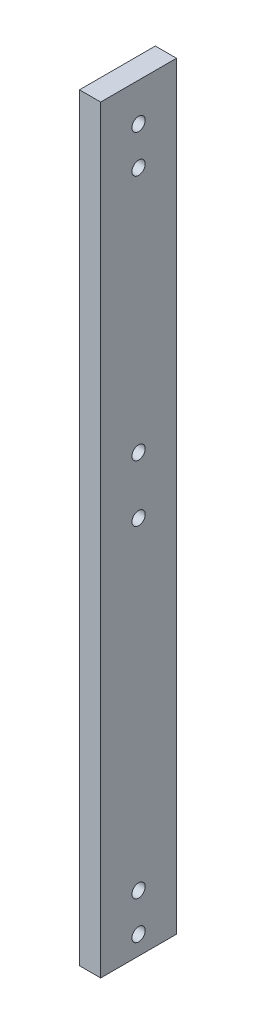
ISO-10303-21;
HEADER;
FILE_DESCRIPTION(('STEP AP214'),'2;1');
FILE_NAME('part.step','',(''),(''),'','','');
FILE_SCHEMA(('AUTOMOTIVE_DESIGN { 1 0 10303 214 1 1 1 1 }'));
ENDSEC;
DATA;
#1=APPLICATION_CONTEXT('core data for automotive mechanical design processes');
#2=APPLICATION_PROTOCOL_DEFINITION('international standard','automotive_design',2000,#1);
#3=PRODUCT_CONTEXT('',#1,'mechanical');
#4=PRODUCT('Part','Part','',(#3));
#5=PRODUCT_RELATED_PRODUCT_CATEGORY('part','',(#4));
#6=PRODUCT_DEFINITION_FORMATION('','',#4);
#7=PRODUCT_DEFINITION_CONTEXT('part definition',#1,'design');
#8=PRODUCT_DEFINITION('design','',#6,#7);
#9=PRODUCT_DEFINITION_SHAPE('','',#8);
#10=(LENGTH_UNIT() NAMED_UNIT(*) SI_UNIT(.MILLI.,.METRE.));
#11=(NAMED_UNIT(*) PLANE_ANGLE_UNIT() SI_UNIT($,.RADIAN.));
#12=(NAMED_UNIT(*) SI_UNIT($,.STERADIAN.) SOLID_ANGLE_UNIT());
#13=UNCERTAINTY_MEASURE_WITH_UNIT(LENGTH_MEASURE(1.E-05),#10,'distance_accuracy_value','');
#14=(GEOMETRIC_REPRESENTATION_CONTEXT(3) GLOBAL_UNCERTAINTY_ASSIGNED_CONTEXT((#13)) GLOBAL_UNIT_ASSIGNED_CONTEXT((#10,
#11,#12)) REPRESENTATION_CONTEXT('',''));
#15=CARTESIAN_POINT('',(0.,0.,0.));
#16=DIRECTION('',(0.,0.,1.));
#17=DIRECTION('',(1.,0.,0.));
#18=AXIS2_PLACEMENT_3D('',#15,#16,#17);
#19=CARTESIAN_POINT('',(5.588,-63.9338497155783,6.74242007213014));
#20=DIRECTION('',(0.,0.,-1.));
#21=DIRECTION('',(-1.,0.,0.));
#22=AXIS2_PLACEMENT_3D('',#19,#20,#21);
#23=PLANE('',#22);
#24=DIRECTION('',(0.,-1.,0.));
#25=VECTOR('',#24,1.);
#26=CARTESIAN_POINT('',(0.,-63.9338497155783,6.74242007213014));
#27=LINE('',#26,#25);
#28=CARTESIAN_POINT('',(0.,136.066150284422,6.74242007213014));
#29=VERTEX_POINT('',#28);
#30=CARTESIAN_POINT('',(0.,-63.9338497155783,6.74242007213014));
#31=VERTEX_POINT('',#30);
#32=EDGE_CURVE('E96',#29,#31,#27,.T.);
#33=ORIENTED_EDGE('',*,*,#32,.T.);
#34=DIRECTION('',(-1.,0.,0.));
#35=VECTOR('',#34,1.);
#36=CARTESIAN_POINT('',(5.588,-63.9338497155783,6.74242007213014));
#37=LINE('',#36,#35);
#38=CARTESIAN_POINT('',(5.588,-63.9338497155783,6.74242007213014));
#39=VERTEX_POINT('',#38);
#40=EDGE_CURVE('E11',#39,#31,#37,.T.);
#41=ORIENTED_EDGE('',*,*,#40,.F.);
#42=DIRECTION('',(0.,-1.,0.));
#43=VECTOR('',#42,1.);
#44=CARTESIAN_POINT('',(5.588,-63.9338497155783,6.74242007213014));
#45=LINE('',#44,#43);
#46=CARTESIAN_POINT('',(5.588,136.066150284422,6.74242007213014));
#47=VERTEX_POINT('',#46);
#48=EDGE_CURVE('E84',#47,#39,#45,.T.);
#49=ORIENTED_EDGE('',*,*,#48,.F.);
#50=DIRECTION('',(-1.,0.,0.));
#51=VECTOR('',#50,1.);
#52=CARTESIAN_POINT('',(5.588,136.066150284422,6.74242007213014));
#53=LINE('',#52,#51);
#54=EDGE_CURVE('E92',#47,#29,#53,.T.);
#55=ORIENTED_EDGE('',*,*,#54,.T.);
#56=EDGE_LOOP('',(#33,#41,#49,#55));
#57=FACE_BOUND('',#56,.T.);
#58=ADVANCED_FACE('F33',(#57),#23,.F.);
#59=CARTESIAN_POINT('',(5.588,-63.9338497155783,6.74242007213014));
#60=DIRECTION('',(0.,1.,0.));
#61=DIRECTION('',(0.,0.,1.));
#62=AXIS2_PLACEMENT_3D('',#59,#60,#61);
#63=PLANE('',#62);
#64=DIRECTION('',(0.,0.,-1.));
#65=VECTOR('',#64,1.);
#66=CARTESIAN_POINT('',(0.,-63.9338497155783,6.74242007213014));
#67=LINE('',#66,#65);
#68=CARTESIAN_POINT('',(0.,-63.9338497155783,-13.2575799278699));
#69=VERTEX_POINT('',#68);
#70=EDGE_CURVE('E88',#31,#69,#67,.T.);
#71=ORIENTED_EDGE('',*,*,#70,.T.);
#72=DIRECTION('',(-1.,0.,0.));
#73=VECTOR('',#72,1.);
#74=CARTESIAN_POINT('',(5.588,-63.9338497155783,-13.2575799278699));
#75=LINE('',#74,#73);
#76=CARTESIAN_POINT('',(5.588,-63.9338497155783,-13.2575799278699));
#77=VERTEX_POINT('',#76);
#78=EDGE_CURVE('E41',#77,#69,#75,.T.);
#79=ORIENTED_EDGE('',*,*,#78,.F.);
#80=DIRECTION('',(0.,0.,-1.));
#81=VECTOR('',#80,1.);
#82=CARTESIAN_POINT('',(5.588,-63.9338497155783,6.74242007213014));
#83=LINE('',#82,#81);
#84=EDGE_CURVE('E79',#39,#77,#83,.T.);
#85=ORIENTED_EDGE('',*,*,#84,.F.);
#86=ORIENTED_EDGE('',*,*,#40,.T.);
#87=EDGE_LOOP('',(#71,#79,#85,#86));
#88=FACE_BOUND('',#87,.T.);
#89=ADVANCED_FACE('F87',(#88),#63,.F.);
#90=CARTESIAN_POINT('',(5.588,-63.9338497155783,-13.2575799278699));
#91=DIRECTION('',(0.,0.,1.));
#92=DIRECTION('',(0.,-1.,0.));
#93=AXIS2_PLACEMENT_3D('',#90,#91,#92);
#94=PLANE('',#93);
#95=DIRECTION('',(0.,1.,0.));
#96=VECTOR('',#95,1.);
#97=CARTESIAN_POINT('',(0.,-63.9338497155783,-13.2575799278699));
#98=LINE('',#97,#96);
#99=CARTESIAN_POINT('',(0.,136.066150284422,-13.2575799278699));
#100=VERTEX_POINT('',#99);
#101=EDGE_CURVE('E66',#69,#100,#98,.T.);
#102=ORIENTED_EDGE('',*,*,#101,.T.);
#103=DIRECTION('',(-1.,0.,0.));
#104=VECTOR('',#103,1.);
#105=CARTESIAN_POINT('',(5.588,136.066150284422,-13.2575799278699));
#106=LINE('',#105,#104);
#107=CARTESIAN_POINT('',(5.588,136.066150284422,-13.2575799278699));
#108=VERTEX_POINT('',#107);
#109=EDGE_CURVE('E89',#108,#100,#106,.T.);
#110=ORIENTED_EDGE('',*,*,#109,.F.);
#111=DIRECTION('',(0.,1.,0.));
#112=VECTOR('',#111,1.);
#113=CARTESIAN_POINT('',(5.588,-63.9338497155783,-13.2575799278699));
#114=LINE('',#113,#112);
#115=EDGE_CURVE('E82',#77,#108,#114,.T.);
#116=ORIENTED_EDGE('',*,*,#115,.F.);
#117=ORIENTED_EDGE('',*,*,#78,.T.);
#118=EDGE_LOOP('',(#102,#110,#116,#117));
#119=FACE_BOUND('',#118,.T.);
#120=ADVANCED_FACE('F90',(#119),#94,.F.);
#121=CARTESIAN_POINT('',(5.588,136.066150284422,6.74242007213014));
#122=DIRECTION('',(0.,-1.,0.));
#123=DIRECTION('',(0.,0.,-1.));
#124=AXIS2_PLACEMENT_3D('',#121,#122,#123);
#125=PLANE('',#124);
#126=DIRECTION('',(0.,0.,1.));
#127=VECTOR('',#126,1.);
#128=CARTESIAN_POINT('',(0.,136.066150284422,6.74242007213014));
#129=LINE('',#128,#127);
#130=EDGE_CURVE('E72',#100,#29,#129,.T.);
#131=ORIENTED_EDGE('',*,*,#130,.T.);
#132=ORIENTED_EDGE('',*,*,#54,.F.);
#133=DIRECTION('',(0.,0.,1.));
#134=VECTOR('',#133,1.);
#135=CARTESIAN_POINT('',(5.588,136.066150284422,6.74242007213014));
#136=LINE('',#135,#134);
#137=EDGE_CURVE('E49',#108,#47,#136,.T.);
#138=ORIENTED_EDGE('',*,*,#137,.F.);
#139=ORIENTED_EDGE('',*,*,#109,.T.);
#140=EDGE_LOOP('',(#131,#132,#138,#139));
#141=FACE_BOUND('',#140,.T.);
#142=ADVANCED_FACE('F104',(#141),#125,.F.);
#143=CARTESIAN_POINT('',(5.588,0.,0.));
#144=DIRECTION('',(-1.,0.,0.));
#145=DIRECTION('',(0.,0.,1.));
#146=AXIS2_PLACEMENT_3D('',#143,#144,#145);
#147=PLANE('',#146);
#148=CARTESIAN_POINT('',(5.588,51.0661502844217,-3.25757992786986));
#149=DIRECTION('',(1.,0.,0.));
#150=DIRECTION('',(0.,0.,-1.));
#151=AXIS2_PLACEMENT_3D('',#148,#149,#150);
#152=CIRCLE('',#151,1.75);
#153=CARTESIAN_POINT('',(5.588,51.0661502844217,-5.00757992786986));
#154=VERTEX_POINT('',#153);
#155=EDGE_CURVE('E140',#154,#154,#152,.T.);
#156=ORIENTED_EDGE('',*,*,#155,.F.);
#157=EDGE_LOOP('',(#156));
#158=FACE_BOUND('',#157,.T.);
#159=CARTESIAN_POINT('',(5.588,36.0661502844217,-3.25757992786986));
#160=DIRECTION('',(1.,0.,0.));
#161=DIRECTION('',(0.,0.,-1.));
#162=AXIS2_PLACEMENT_3D('',#159,#160,#161);
#163=CIRCLE('',#162,1.75);
#164=CARTESIAN_POINT('',(5.588,36.0661502844217,-5.00757992786986));
#165=VERTEX_POINT('',#164);
#166=EDGE_CURVE('E134',#165,#165,#163,.T.);
#167=ORIENTED_EDGE('',*,*,#166,.F.);
#168=EDGE_LOOP('',(#167));
#169=FACE_BOUND('',#168,.T.);
#170=CARTESIAN_POINT('',(5.588,126.066150284422,-3.25757992786986));
#171=DIRECTION('',(1.,0.,0.));
#172=DIRECTION('',(0.,0.,-1.));
#173=AXIS2_PLACEMENT_3D('',#170,#171,#172);
#174=CIRCLE('',#173,1.75);
#175=CARTESIAN_POINT('',(5.588,126.066150284422,-5.00757992786986));
#176=VERTEX_POINT('',#175);
#177=EDGE_CURVE('E128',#176,#176,#174,.T.);
#178=ORIENTED_EDGE('',*,*,#177,.F.);
#179=EDGE_LOOP('',(#178));
#180=FACE_BOUND('',#179,.T.);
#181=CARTESIAN_POINT('',(5.588,116.066150284422,-3.25757992786986));
#182=DIRECTION('',(1.,0.,0.));
#183=DIRECTION('',(0.,0.,-1.));
#184=AXIS2_PLACEMENT_3D('',#181,#182,#183);
#185=CIRCLE('',#184,1.75);
#186=CARTESIAN_POINT('',(5.588,116.066150284422,-5.00757992786986));
#187=VERTEX_POINT('',#186);
#188=EDGE_CURVE('E122',#187,#187,#185,.T.);
#189=ORIENTED_EDGE('',*,*,#188,.F.);
#190=EDGE_LOOP('',(#189));
#191=FACE_BOUND('',#190,.T.);
#192=CARTESIAN_POINT('',(5.588,-48.9338497155783,-3.25757992786986));
#193=DIRECTION('',(1.,0.,0.));
#194=DIRECTION('',(0.,0.,-1.));
#195=AXIS2_PLACEMENT_3D('',#192,#193,#194);
#196=CIRCLE('',#195,1.75);
#197=CARTESIAN_POINT('',(5.588,-48.9338497155783,-5.00757992786986));
#198=VERTEX_POINT('',#197);
#199=EDGE_CURVE('E116',#198,#198,#196,.T.);
#200=ORIENTED_EDGE('',*,*,#199,.F.);
#201=EDGE_LOOP('',(#200));
#202=FACE_BOUND('',#201,.T.);
#203=CARTESIAN_POINT('',(5.588,-58.9338497155783,-3.25757992786986));
#204=DIRECTION('',(1.,0.,0.));
#205=DIRECTION('',(0.,0.,-1.));
#206=AXIS2_PLACEMENT_3D('',#203,#204,#205);
#207=CIRCLE('',#206,1.75);
#208=CARTESIAN_POINT('',(5.588,-58.9338497155783,-5.00757992786986));
#209=VERTEX_POINT('',#208);
#210=EDGE_CURVE('E110',#209,#209,#207,.T.);
#211=ORIENTED_EDGE('',*,*,#210,.F.);
#212=EDGE_LOOP('',(#211));
#213=FACE_BOUND('',#212,.T.);
#214=ORIENTED_EDGE('',*,*,#48,.T.);
#215=ORIENTED_EDGE('',*,*,#84,.T.);
#216=ORIENTED_EDGE('',*,*,#115,.T.);
#217=ORIENTED_EDGE('',*,*,#137,.T.);
#218=EDGE_LOOP('',(#214,#215,#216,#217));
#219=FACE_BOUND('',#218,.T.);
#220=ADVANCED_FACE('F80',(#158,#169,#180,#191,#202,#213,#219),#147,.F.);
#221=CARTESIAN_POINT('',(0.,0.,0.));
#222=DIRECTION('',(-1.,0.,0.));
#223=DIRECTION('',(0.,0.,1.));
#224=AXIS2_PLACEMENT_3D('',#221,#222,#223);
#225=PLANE('',#224);
#226=CARTESIAN_POINT('',(0.,51.0661502844217,-3.25757992786986));
#227=DIRECTION('',(1.,0.,0.));
#228=DIRECTION('',(0.,0.,-1.));
#229=AXIS2_PLACEMENT_3D('',#226,#227,#228);
#230=CIRCLE('',#229,1.75);
#231=CARTESIAN_POINT('',(0.,51.0661502844217,-5.00757992786986));
#232=VERTEX_POINT('',#231);
#233=EDGE_CURVE('E137',#232,#232,#230,.T.);
#234=ORIENTED_EDGE('',*,*,#233,.T.);
#235=EDGE_LOOP('',(#234));
#236=FACE_BOUND('',#235,.T.);
#237=CARTESIAN_POINT('',(0.,36.0661502844217,-3.25757992786986));
#238=DIRECTION('',(1.,0.,0.));
#239=DIRECTION('',(0.,0.,-1.));
#240=AXIS2_PLACEMENT_3D('',#237,#238,#239);
#241=CIRCLE('',#240,1.75);
#242=CARTESIAN_POINT('',(0.,36.0661502844217,-5.00757992786986));
#243=VERTEX_POINT('',#242);
#244=EDGE_CURVE('E131',#243,#243,#241,.T.);
#245=ORIENTED_EDGE('',*,*,#244,.T.);
#246=EDGE_LOOP('',(#245));
#247=FACE_BOUND('',#246,.T.);
#248=CARTESIAN_POINT('',(0.,126.066150284422,-3.25757992786986));
#249=DIRECTION('',(1.,0.,0.));
#250=DIRECTION('',(0.,0.,-1.));
#251=AXIS2_PLACEMENT_3D('',#248,#249,#250);
#252=CIRCLE('',#251,1.75);
#253=CARTESIAN_POINT('',(0.,126.066150284422,-5.00757992786986));
#254=VERTEX_POINT('',#253);
#255=EDGE_CURVE('E125',#254,#254,#252,.T.);
#256=ORIENTED_EDGE('',*,*,#255,.T.);
#257=EDGE_LOOP('',(#256));
#258=FACE_BOUND('',#257,.T.);
#259=CARTESIAN_POINT('',(0.,116.066150284422,-3.25757992786986));
#260=DIRECTION('',(1.,0.,0.));
#261=DIRECTION('',(0.,0.,-1.));
#262=AXIS2_PLACEMENT_3D('',#259,#260,#261);
#263=CIRCLE('',#262,1.75);
#264=CARTESIAN_POINT('',(0.,116.066150284422,-5.00757992786986));
#265=VERTEX_POINT('',#264);
#266=EDGE_CURVE('E119',#265,#265,#263,.T.);
#267=ORIENTED_EDGE('',*,*,#266,.T.);
#268=EDGE_LOOP('',(#267));
#269=FACE_BOUND('',#268,.T.);
#270=CARTESIAN_POINT('',(0.,-48.9338497155783,-3.25757992786986));
#271=DIRECTION('',(1.,0.,0.));
#272=DIRECTION('',(0.,0.,-1.));
#273=AXIS2_PLACEMENT_3D('',#270,#271,#272);
#274=CIRCLE('',#273,1.75);
#275=CARTESIAN_POINT('',(0.,-48.9338497155783,-5.00757992786986));
#276=VERTEX_POINT('',#275);
#277=EDGE_CURVE('E113',#276,#276,#274,.T.);
#278=ORIENTED_EDGE('',*,*,#277,.T.);
#279=EDGE_LOOP('',(#278));
#280=FACE_BOUND('',#279,.T.);
#281=CARTESIAN_POINT('',(0.,-58.9338497155783,-3.25757992786986));
#282=DIRECTION('',(1.,0.,0.));
#283=DIRECTION('',(0.,0.,-1.));
#284=AXIS2_PLACEMENT_3D('',#281,#282,#283);
#285=CIRCLE('',#284,1.75);
#286=CARTESIAN_POINT('',(0.,-58.9338497155783,-5.00757992786986));
#287=VERTEX_POINT('',#286);
#288=EDGE_CURVE('E99',#287,#287,#285,.T.);
#289=ORIENTED_EDGE('',*,*,#288,.T.);
#290=EDGE_LOOP('',(#289));
#291=FACE_BOUND('',#290,.T.);
#292=ORIENTED_EDGE('',*,*,#32,.F.);
#293=ORIENTED_EDGE('',*,*,#130,.F.);
#294=ORIENTED_EDGE('',*,*,#101,.F.);
#295=ORIENTED_EDGE('',*,*,#70,.F.);
#296=EDGE_LOOP('',(#292,#293,#294,#295));
#297=FACE_BOUND('',#296,.T.);
#298=ADVANCED_FACE('F107',(#236,#247,#258,#269,#280,#291,#297),#225,.T.);
#299=CARTESIAN_POINT('',(0.,-58.9338497155783,-3.25757992786986));
#300=DIRECTION('',(1.,0.,0.));
#301=DIRECTION('',(0.,0.,-1.));
#302=AXIS2_PLACEMENT_3D('',#299,#300,#301);
#303=CYLINDRICAL_SURFACE('',#302,1.75);
#304=ORIENTED_EDGE('',*,*,#288,.F.);
#305=EDGE_LOOP('',(#304));
#306=FACE_BOUND('',#305,.T.);
#307=ORIENTED_EDGE('',*,*,#210,.T.);
#308=EDGE_LOOP('',(#307));
#309=FACE_BOUND('',#308,.T.);
#310=ADVANCED_FACE('F168',(#306,#309),#303,.F.);
#311=CARTESIAN_POINT('',(0.,-48.9338497155783,-3.25757992786986));
#312=DIRECTION('',(1.,0.,0.));
#313=DIRECTION('',(0.,0.,-1.));
#314=AXIS2_PLACEMENT_3D('',#311,#312,#313);
#315=CYLINDRICAL_SURFACE('',#314,1.75);
#316=ORIENTED_EDGE('',*,*,#277,.F.);
#317=EDGE_LOOP('',(#316));
#318=FACE_BOUND('',#317,.T.);
#319=ORIENTED_EDGE('',*,*,#199,.T.);
#320=EDGE_LOOP('',(#319));
#321=FACE_BOUND('',#320,.T.);
#322=ADVANCED_FACE('F170',(#318,#321),#315,.F.);
#323=CARTESIAN_POINT('',(0.,116.066150284422,-3.25757992786986));
#324=DIRECTION('',(1.,0.,0.));
#325=DIRECTION('',(0.,0.,-1.));
#326=AXIS2_PLACEMENT_3D('',#323,#324,#325);
#327=CYLINDRICAL_SURFACE('',#326,1.75);
#328=ORIENTED_EDGE('',*,*,#266,.F.);
#329=EDGE_LOOP('',(#328));
#330=FACE_BOUND('',#329,.T.);
#331=ORIENTED_EDGE('',*,*,#188,.T.);
#332=EDGE_LOOP('',(#331));
#333=FACE_BOUND('',#332,.T.);
#334=ADVANCED_FACE('F177',(#330,#333),#327,.F.);
#335=CARTESIAN_POINT('',(0.,126.066150284422,-3.25757992786986));
#336=DIRECTION('',(1.,0.,0.));
#337=DIRECTION('',(0.,0.,-1.));
#338=AXIS2_PLACEMENT_3D('',#335,#336,#337);
#339=CYLINDRICAL_SURFACE('',#338,1.75);
#340=ORIENTED_EDGE('',*,*,#255,.F.);
#341=EDGE_LOOP('',(#340));
#342=FACE_BOUND('',#341,.T.);
#343=ORIENTED_EDGE('',*,*,#177,.T.);
#344=EDGE_LOOP('',(#343));
#345=FACE_BOUND('',#344,.T.);
#346=ADVANCED_FACE('F215',(#342,#345),#339,.F.);
#347=CARTESIAN_POINT('',(0.,36.0661502844217,-3.25757992786986));
#348=DIRECTION('',(1.,0.,0.));
#349=DIRECTION('',(0.,0.,-1.));
#350=AXIS2_PLACEMENT_3D('',#347,#348,#349);
#351=CYLINDRICAL_SURFACE('',#350,1.75);
#352=ORIENTED_EDGE('',*,*,#244,.F.);
#353=EDGE_LOOP('',(#352));
#354=FACE_BOUND('',#353,.T.);
#355=ORIENTED_EDGE('',*,*,#166,.T.);
#356=EDGE_LOOP('',(#355));
#357=FACE_BOUND('',#356,.T.);
#358=ADVANCED_FACE('F151',(#354,#357),#351,.F.);
#359=CARTESIAN_POINT('',(0.,51.0661502844217,-3.25757992786986));
#360=DIRECTION('',(1.,0.,0.));
#361=DIRECTION('',(0.,0.,-1.));
#362=AXIS2_PLACEMENT_3D('',#359,#360,#361);
#363=CYLINDRICAL_SURFACE('',#362,1.75);
#364=ORIENTED_EDGE('',*,*,#233,.F.);
#365=EDGE_LOOP('',(#364));
#366=FACE_BOUND('',#365,.T.);
#367=ORIENTED_EDGE('',*,*,#155,.T.);
#368=EDGE_LOOP('',(#367));
#369=FACE_BOUND('',#368,.T.);
#370=ADVANCED_FACE('F148',(#366,#369),#363,.F.);
#371=CLOSED_SHELL('',(#58,#89,#120,#142,#220,#298,#310,#322,#334,#346,#358,#370));
#372=MANIFOLD_SOLID_BREP('B2',#371);
#373=ADVANCED_BREP_SHAPE_REPRESENTATION('',(#18,#372),#14);
#374=SHAPE_DEFINITION_REPRESENTATION(#9,#373);
ENDSEC;
END-ISO-10303-21;
